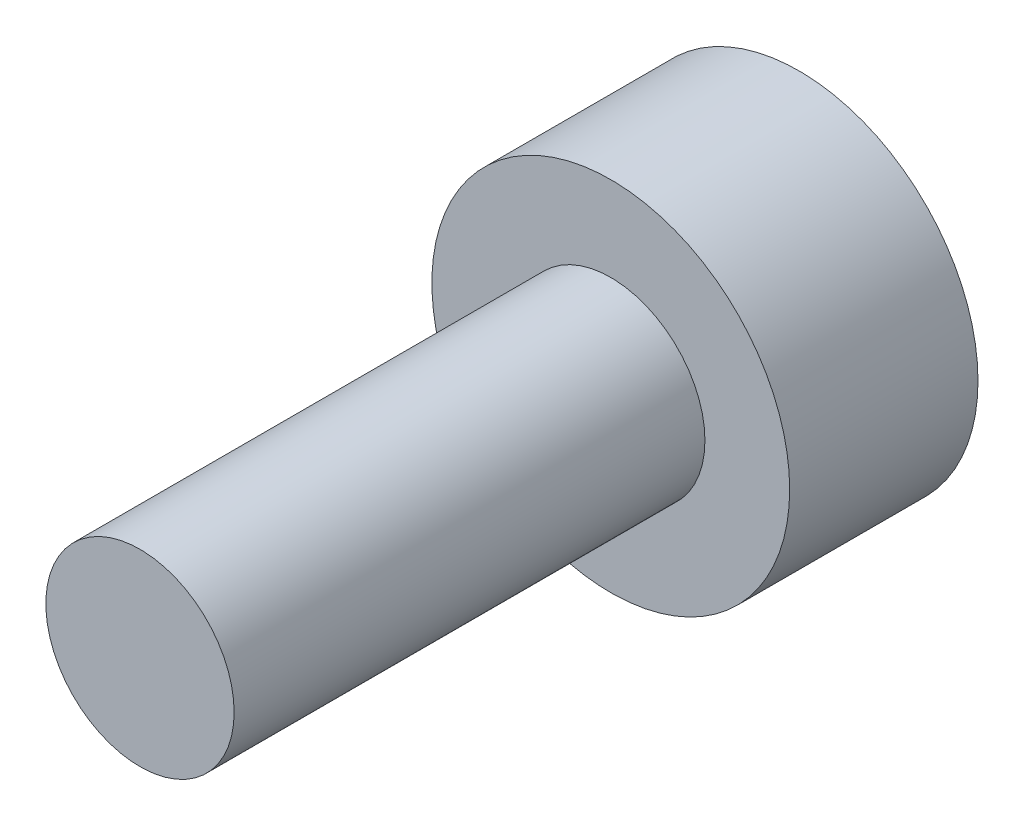
ISO-10303-21;
HEADER;
FILE_DESCRIPTION(('STEP AP214'),'2;1');
FILE_NAME('part.step','',(''),(''),'','','');
FILE_SCHEMA(('AUTOMOTIVE_DESIGN { 1 0 10303 214 1 1 1 1 }'));
ENDSEC;
DATA;
#1=APPLICATION_CONTEXT('core data for automotive mechanical design processes');
#2=APPLICATION_PROTOCOL_DEFINITION('international standard','automotive_design',2000,#1);
#3=PRODUCT_CONTEXT('',#1,'mechanical');
#4=PRODUCT('Part','Part','',(#3));
#5=PRODUCT_RELATED_PRODUCT_CATEGORY('part','',(#4));
#6=PRODUCT_DEFINITION_FORMATION('','',#4);
#7=PRODUCT_DEFINITION_CONTEXT('part definition',#1,'design');
#8=PRODUCT_DEFINITION('design','',#6,#7);
#9=PRODUCT_DEFINITION_SHAPE('','',#8);
#10=(LENGTH_UNIT() NAMED_UNIT(*) SI_UNIT(.MILLI.,.METRE.));
#11=(NAMED_UNIT(*) PLANE_ANGLE_UNIT() SI_UNIT($,.RADIAN.));
#12=(NAMED_UNIT(*) SI_UNIT($,.STERADIAN.) SOLID_ANGLE_UNIT());
#13=UNCERTAINTY_MEASURE_WITH_UNIT(LENGTH_MEASURE(1.E-05),#10,'distance_accuracy_value','');
#14=(GEOMETRIC_REPRESENTATION_CONTEXT(3) GLOBAL_UNCERTAINTY_ASSIGNED_CONTEXT((#13)) GLOBAL_UNIT_ASSIGNED_CONTEXT((#10,
#11,#12)) REPRESENTATION_CONTEXT('',''));
#15=CARTESIAN_POINT('',(0.,0.,0.));
#16=DIRECTION('',(0.,0.,1.));
#17=DIRECTION('',(1.,0.,0.));
#18=AXIS2_PLACEMENT_3D('',#15,#16,#17);
#19=CARTESIAN_POINT('',(0.,0.,0.));
#20=DIRECTION('',(0.,0.,-1.));
#21=DIRECTION('',(-1.,0.,0.));
#22=AXIS2_PLACEMENT_3D('',#19,#20,#21);
#23=CYLINDRICAL_SURFACE('',#22,1.9);
#24=CARTESIAN_POINT('',(0.,0.,0.));
#25=DIRECTION('',(0.,0.,1.));
#26=DIRECTION('',(1.,0.,0.));
#27=AXIS2_PLACEMENT_3D('',#24,#25,#26);
#28=CIRCLE('',#27,1.9);
#29=CARTESIAN_POINT('',(1.9,0.,0.));
#30=VERTEX_POINT('',#29);
#31=EDGE_CURVE('E42',#30,#30,#28,.T.);
#32=ORIENTED_EDGE('',*,*,#31,.F.);
#33=EDGE_LOOP('',(#32));
#34=FACE_BOUND('',#33,.T.);
#35=CARTESIAN_POINT('',(0.,0.,-2.));
#36=DIRECTION('',(0.,0.,1.));
#37=DIRECTION('',(1.,0.,0.));
#38=AXIS2_PLACEMENT_3D('',#35,#36,#37);
#39=CIRCLE('',#38,1.9);
#40=CARTESIAN_POINT('',(1.9,0.,-2.));
#41=VERTEX_POINT('',#40);
#42=EDGE_CURVE('E37',#41,#41,#39,.T.);
#43=ORIENTED_EDGE('',*,*,#42,.T.);
#44=EDGE_LOOP('',(#43));
#45=FACE_BOUND('',#44,.T.);
#46=ADVANCED_FACE('F40',(#34,#45),#23,.T.);
#47=CARTESIAN_POINT('',(0.,0.,0.));
#48=DIRECTION('',(0.,0.,1.));
#49=DIRECTION('',(1.,0.,0.));
#50=AXIS2_PLACEMENT_3D('',#47,#48,#49);
#51=PLANE('',#50);
#52=CARTESIAN_POINT('',(0.,0.,0.));
#53=DIRECTION('',(0.,0.,1.));
#54=DIRECTION('',(1.,0.,0.));
#55=AXIS2_PLACEMENT_3D('',#52,#53,#54);
#56=CIRCLE('',#55,1.);
#57=CARTESIAN_POINT('',(1.,0.,0.));
#58=VERTEX_POINT('',#57);
#59=EDGE_CURVE('E10',#58,#58,#56,.T.);
#60=ORIENTED_EDGE('',*,*,#59,.F.);
#61=EDGE_LOOP('',(#60));
#62=FACE_BOUND('',#61,.T.);
#63=ORIENTED_EDGE('',*,*,#31,.T.);
#64=EDGE_LOOP('',(#63));
#65=FACE_BOUND('',#64,.T.);
#66=ADVANCED_FACE('F62',(#62,#65),#51,.T.);
#67=CARTESIAN_POINT('',(0.,0.,-2.));
#68=DIRECTION('',(0.,0.,1.));
#69=DIRECTION('',(1.,0.,0.));
#70=AXIS2_PLACEMENT_3D('',#67,#68,#69);
#71=PLANE('',#70);
#72=ORIENTED_EDGE('',*,*,#42,.F.);
#73=EDGE_LOOP('',(#72));
#74=FACE_BOUND('',#73,.T.);
#75=ADVANCED_FACE('F59',(#74),#71,.F.);
#76=CARTESIAN_POINT('',(0.,0.,5.));
#77=DIRECTION('',(0.,0.,-1.));
#78=DIRECTION('',(-1.,0.,0.));
#79=AXIS2_PLACEMENT_3D('',#76,#77,#78);
#80=CYLINDRICAL_SURFACE('',#79,1.);
#81=CARTESIAN_POINT('',(0.,0.,5.));
#82=DIRECTION('',(0.,0.,1.));
#83=DIRECTION('',(1.,0.,0.));
#84=AXIS2_PLACEMENT_3D('',#81,#82,#83);
#85=CIRCLE('',#84,1.);
#86=CARTESIAN_POINT('',(1.,0.,5.));
#87=VERTEX_POINT('',#86);
#88=EDGE_CURVE('E49',#87,#87,#85,.T.);
#89=ORIENTED_EDGE('',*,*,#88,.F.);
#90=EDGE_LOOP('',(#89));
#91=FACE_BOUND('',#90,.T.);
#92=ORIENTED_EDGE('',*,*,#59,.T.);
#93=EDGE_LOOP('',(#92));
#94=FACE_BOUND('',#93,.T.);
#95=ADVANCED_FACE('F58',(#91,#94),#80,.T.);
#96=CARTESIAN_POINT('',(0.,0.,5.));
#97=DIRECTION('',(0.,0.,1.));
#98=DIRECTION('',(1.,0.,0.));
#99=AXIS2_PLACEMENT_3D('',#96,#97,#98);
#100=PLANE('',#99);
#101=ORIENTED_EDGE('',*,*,#88,.T.);
#102=EDGE_LOOP('',(#101));
#103=FACE_BOUND('',#102,.T.);
#104=ADVANCED_FACE('F70',(#103),#100,.T.);
#105=CLOSED_SHELL('',(#46,#66,#75,#95,#104));
#106=MANIFOLD_SOLID_BREP('B2',#105);
#107=ADVANCED_BREP_SHAPE_REPRESENTATION('',(#18,#106),#14);
#108=SHAPE_DEFINITION_REPRESENTATION(#9,#107);
ENDSEC;
END-ISO-10303-21;
